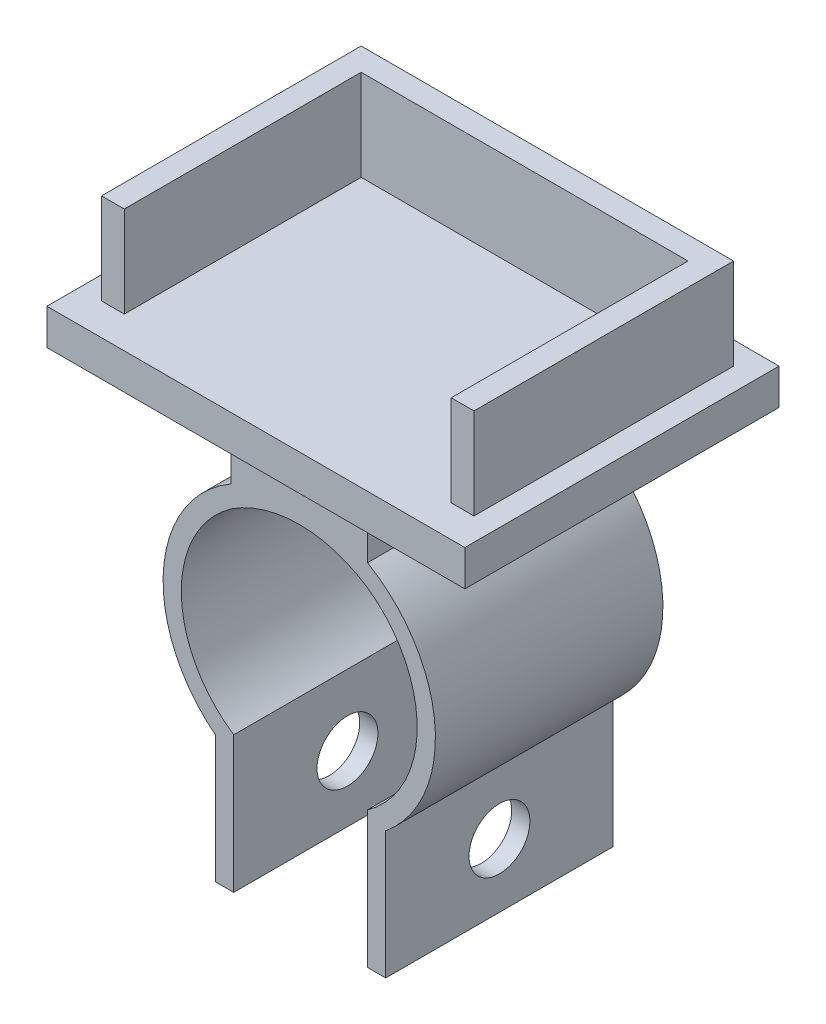
ISO-10303-21;
HEADER;
FILE_DESCRIPTION(('STEP AP214'),'2;1');
FILE_NAME('part.step','',(''),(''),'','','');
FILE_SCHEMA(('AUTOMOTIVE_DESIGN { 1 0 10303 214 1 1 1 1 }'));
ENDSEC;
DATA;
#1=APPLICATION_CONTEXT('core data for automotive mechanical design processes');
#2=APPLICATION_PROTOCOL_DEFINITION('international standard','automotive_design',2000,#1);
#3=PRODUCT_CONTEXT('',#1,'mechanical');
#4=PRODUCT('Part','Part','',(#3));
#5=PRODUCT_RELATED_PRODUCT_CATEGORY('part','',(#4));
#6=PRODUCT_DEFINITION_FORMATION('','',#4);
#7=PRODUCT_DEFINITION_CONTEXT('part definition',#1,'design');
#8=PRODUCT_DEFINITION('design','',#6,#7);
#9=PRODUCT_DEFINITION_SHAPE('','',#8);
#10=(LENGTH_UNIT() NAMED_UNIT(*) SI_UNIT(.MILLI.,.METRE.));
#11=(NAMED_UNIT(*) PLANE_ANGLE_UNIT() SI_UNIT($,.RADIAN.));
#12=(NAMED_UNIT(*) SI_UNIT($,.STERADIAN.) SOLID_ANGLE_UNIT());
#13=UNCERTAINTY_MEASURE_WITH_UNIT(LENGTH_MEASURE(1.E-05),#10,'distance_accuracy_value','');
#14=(GEOMETRIC_REPRESENTATION_CONTEXT(3) GLOBAL_UNCERTAINTY_ASSIGNED_CONTEXT((#13)) GLOBAL_UNIT_ASSIGNED_CONTEXT((#10,
#11,#12)) REPRESENTATION_CONTEXT('',''));
#15=CARTESIAN_POINT('',(0.,0.,0.));
#16=DIRECTION('',(0.,0.,1.));
#17=DIRECTION('',(1.,0.,0.));
#18=AXIS2_PLACEMENT_3D('',#15,#16,#17);
#19=CARTESIAN_POINT('',(0.,0.,0.));
#20=DIRECTION('',(0.,1.,0.));
#21=DIRECTION('',(0.,0.,1.));
#22=AXIS2_PLACEMENT_3D('',#19,#20,#21);
#23=PLANE('',#22);
#24=DIRECTION('',(1.,0.,0.));
#25=VECTOR('',#24,1.);
#26=CARTESIAN_POINT('',(0.,0.,0.));
#27=LINE('',#26,#25);
#28=CARTESIAN_POINT('',(0.,0.,0.));
#29=VERTEX_POINT('',#28);
#30=CARTESIAN_POINT('',(23.330000076,0.,0.));
#31=VERTEX_POINT('',#30);
#32=EDGE_CURVE('E305',#29,#31,#27,.T.);
#33=ORIENTED_EDGE('',*,*,#32,.F.);
#34=DIRECTION('',(0.,0.,-1.));
#35=VECTOR('',#34,1.);
#36=CARTESIAN_POINT('',(0.,0.,0.));
#37=LINE('',#36,#35);
#38=CARTESIAN_POINT('',(0.,0.,-17.539999972));
#39=VERTEX_POINT('',#38);
#40=EDGE_CURVE('E310',#29,#39,#37,.T.);
#41=ORIENTED_EDGE('',*,*,#40,.T.);
#42=DIRECTION('',(1.,0.,0.));
#43=VECTOR('',#42,1.);
#44=CARTESIAN_POINT('',(0.,0.,-17.539999972));
#45=LINE('',#44,#43);
#46=CARTESIAN_POINT('',(23.330000076,0.,-17.539999972));
#47=VERTEX_POINT('',#46);
#48=EDGE_CURVE('E324',#39,#47,#45,.T.);
#49=ORIENTED_EDGE('',*,*,#48,.T.);
#50=DIRECTION('',(0.,0.,-1.));
#51=VECTOR('',#50,1.);
#52=CARTESIAN_POINT('',(23.330000076,0.,0.));
#53=LINE('',#52,#51);
#54=EDGE_CURVE('E321',#31,#47,#53,.T.);
#55=ORIENTED_EDGE('',*,*,#54,.F.);
#56=EDGE_LOOP('',(#33,#41,#49,#55));
#57=FACE_BOUND('',#56,.T.);
#58=DIRECTION('',(0.,0.,-1.));
#59=VECTOR('',#58,1.);
#60=CARTESIAN_POINT('',(7.855000038,0.,-2.41999998599999));
#61=LINE('',#60,#59);
#62=CARTESIAN_POINT('',(7.855000038,0.,-2.41999998599999));
#63=VERTEX_POINT('',#62);
#64=CARTESIAN_POINT('',(7.85500003800001,0.,-15.119999986));
#65=VERTEX_POINT('',#64);
#66=EDGE_CURVE('E242',#63,#65,#61,.T.);
#67=ORIENTED_EDGE('',*,*,#66,.F.);
#68=DIRECTION('',(-1.,0.,0.));
#69=VECTOR('',#68,1.);
#70=CARTESIAN_POINT('',(7.855000038,0.,-2.41999998599999));
#71=LINE('',#70,#69);
#72=CARTESIAN_POINT('',(15.475000038,0.,-2.41999998599999));
#73=VERTEX_POINT('',#72);
#74=EDGE_CURVE('E727',#73,#63,#71,.T.);
#75=ORIENTED_EDGE('',*,*,#74,.F.);
#76=DIRECTION('',(0.,0.,1.));
#77=VECTOR('',#76,1.);
#78=CARTESIAN_POINT('',(15.475000038,0.,-2.41999998599999));
#79=LINE('',#78,#77);
#80=CARTESIAN_POINT('',(15.475000038,0.,-15.119999986));
#81=VERTEX_POINT('',#80);
#82=EDGE_CURVE('E733',#81,#73,#79,.T.);
#83=ORIENTED_EDGE('',*,*,#82,.F.);
#84=DIRECTION('',(1.,0.,0.));
#85=VECTOR('',#84,1.);
#86=CARTESIAN_POINT('',(7.85500003800001,0.,-15.119999986));
#87=LINE('',#86,#85);
#88=EDGE_CURVE('E731',#65,#81,#87,.T.);
#89=ORIENTED_EDGE('',*,*,#88,.F.);
#90=EDGE_LOOP('',(#67,#75,#83,#89));
#91=FACE_BOUND('',#90,.T.);
#92=ADVANCED_FACE('F43',(#57,#91),#23,.F.);
#93=CARTESIAN_POINT('',(0.,2.,0.));
#94=DIRECTION('',(0.,1.,0.));
#95=DIRECTION('',(0.,0.,1.));
#96=AXIS2_PLACEMENT_3D('',#93,#94,#95);
#97=PLANE('',#96);
#98=DIRECTION('',(1.,0.,0.));
#99=VECTOR('',#98,1.);
#100=CARTESIAN_POINT('',(0.,2.,0.));
#101=LINE('',#100,#99);
#102=CARTESIAN_POINT('',(0.,2.,0.));
#103=VERTEX_POINT('',#102);
#104=CARTESIAN_POINT('',(23.330000076,2.,0.));
#105=VERTEX_POINT('',#104);
#106=EDGE_CURVE('E306',#103,#105,#101,.T.);
#107=ORIENTED_EDGE('',*,*,#106,.T.);
#108=DIRECTION('',(0.,0.,-1.));
#109=VECTOR('',#108,1.);
#110=CARTESIAN_POINT('',(23.330000076,2.,0.));
#111=LINE('',#110,#109);
#112=CARTESIAN_POINT('',(23.330000076,2.,-17.539999972));
#113=VERTEX_POINT('',#112);
#114=EDGE_CURVE('E309',#105,#113,#111,.T.);
#115=ORIENTED_EDGE('',*,*,#114,.T.);
#116=DIRECTION('',(1.,0.,0.));
#117=VECTOR('',#116,1.);
#118=CARTESIAN_POINT('',(0.,2.,-17.539999972));
#119=LINE('',#118,#117);
#120=CARTESIAN_POINT('',(0.,2.,-17.539999972));
#121=VERTEX_POINT('',#120);
#122=EDGE_CURVE('E312',#121,#113,#119,.T.);
#123=ORIENTED_EDGE('',*,*,#122,.F.);
#124=DIRECTION('',(0.,0.,-1.));
#125=VECTOR('',#124,1.);
#126=CARTESIAN_POINT('',(0.,2.,0.));
#127=LINE('',#126,#125);
#128=EDGE_CURVE('E315',#103,#121,#127,.T.);
#129=ORIENTED_EDGE('',*,*,#128,.F.);
#130=EDGE_LOOP('',(#107,#115,#123,#129));
#131=FACE_BOUND('',#130,.T.);
#132=DIRECTION('',(0.,0.,1.));
#133=VECTOR('',#132,1.);
#134=CARTESIAN_POINT('',(1.27,2.,-1.778));
#135=LINE('',#134,#133);
#136=CARTESIAN_POINT('',(1.27,2.,-16.269999972));
#137=VERTEX_POINT('',#136);
#138=CARTESIAN_POINT('',(1.27,2.,-1.778));
#139=VERTEX_POINT('',#138);
#140=EDGE_CURVE('E247',#137,#139,#135,.T.);
#141=ORIENTED_EDGE('',*,*,#140,.F.);
#142=DIRECTION('',(-1.,0.,0.));
#143=VECTOR('',#142,1.);
#144=CARTESIAN_POINT('',(22.060000076,2.,-16.269999972));
#145=LINE('',#144,#143);
#146=CARTESIAN_POINT('',(22.060000076,2.,-16.269999972));
#147=VERTEX_POINT('',#146);
#148=EDGE_CURVE('E243',#147,#137,#145,.T.);
#149=ORIENTED_EDGE('',*,*,#148,.F.);
#150=DIRECTION('',(0.,0.,-1.));
#151=VECTOR('',#150,1.);
#152=CARTESIAN_POINT('',(22.060000076,2.,-16.269999972));
#153=LINE('',#152,#151);
#154=CARTESIAN_POINT('',(22.060000076,2.,-1.778));
#155=VERTEX_POINT('',#154);
#156=EDGE_CURVE('E256',#155,#147,#153,.T.);
#157=ORIENTED_EDGE('',*,*,#156,.F.);
#158=DIRECTION('',(1.,0.,0.));
#159=VECTOR('',#158,1.);
#160=CARTESIAN_POINT('',(20.790000076,2.,-1.778));
#161=LINE('',#160,#159);
#162=CARTESIAN_POINT('',(20.790000076,2.,-1.778));
#163=VERTEX_POINT('',#162);
#164=EDGE_CURVE('E280',#163,#155,#161,.T.);
#165=ORIENTED_EDGE('',*,*,#164,.F.);
#166=DIRECTION('',(0.,0.,1.));
#167=VECTOR('',#166,1.);
#168=CARTESIAN_POINT('',(20.790000076,2.,-14.999999972));
#169=LINE('',#168,#167);
#170=CARTESIAN_POINT('',(20.790000076,2.,-14.999999972));
#171=VERTEX_POINT('',#170);
#172=EDGE_CURVE('E278',#171,#163,#169,.T.);
#173=ORIENTED_EDGE('',*,*,#172,.F.);
#174=DIRECTION('',(1.,0.,0.));
#175=VECTOR('',#174,1.);
#176=CARTESIAN_POINT('',(20.790000076,2.,-14.999999972));
#177=LINE('',#176,#175);
#178=CARTESIAN_POINT('',(2.54,2.,-14.999999972));
#179=VERTEX_POINT('',#178);
#180=EDGE_CURVE('E276',#179,#171,#177,.T.);
#181=ORIENTED_EDGE('',*,*,#180,.F.);
#182=DIRECTION('',(0.,0.,-1.));
#183=VECTOR('',#182,1.);
#184=CARTESIAN_POINT('',(2.54,2.,-1.778));
#185=LINE('',#184,#183);
#186=CARTESIAN_POINT('',(2.54,2.,-1.778));
#187=VERTEX_POINT('',#186);
#188=EDGE_CURVE('E274',#187,#179,#185,.T.);
#189=ORIENTED_EDGE('',*,*,#188,.F.);
#190=DIRECTION('',(1.,0.,0.));
#191=VECTOR('',#190,1.);
#192=CARTESIAN_POINT('',(1.27,2.,-1.778));
#193=LINE('',#192,#191);
#194=EDGE_CURVE('E272',#139,#187,#193,.T.);
#195=ORIENTED_EDGE('',*,*,#194,.F.);
#196=EDGE_LOOP('',(#141,#149,#157,#165,#173,#181,#189,#195));
#197=FACE_BOUND('',#196,.T.);
#198=ADVANCED_FACE('F349',(#131,#197),#97,.T.);
#199=CARTESIAN_POINT('',(0.,2.,0.));
#200=DIRECTION('',(0.,0.,-1.));
#201=DIRECTION('',(-1.,0.,0.));
#202=AXIS2_PLACEMENT_3D('',#199,#200,#201);
#203=PLANE('',#202);
#204=ORIENTED_EDGE('',*,*,#32,.T.);
#205=DIRECTION('',(0.,-1.,0.));
#206=VECTOR('',#205,1.);
#207=CARTESIAN_POINT('',(23.330000076,2.,0.));
#208=LINE('',#207,#206);
#209=EDGE_CURVE('E11',#105,#31,#208,.T.);
#210=ORIENTED_EDGE('',*,*,#209,.F.);
#211=ORIENTED_EDGE('',*,*,#106,.F.);
#212=DIRECTION('',(0.,-1.,0.));
#213=VECTOR('',#212,1.);
#214=CARTESIAN_POINT('',(0.,2.,0.));
#215=LINE('',#214,#213);
#216=EDGE_CURVE('E318',#103,#29,#215,.T.);
#217=ORIENTED_EDGE('',*,*,#216,.T.);
#218=EDGE_LOOP('',(#204,#210,#211,#217));
#219=FACE_BOUND('',#218,.T.);
#220=ADVANCED_FACE('F45',(#219),#203,.F.);
#221=CARTESIAN_POINT('',(23.330000076,2.,0.));
#222=DIRECTION('',(-1.,0.,0.));
#223=DIRECTION('',(0.,0.,1.));
#224=AXIS2_PLACEMENT_3D('',#221,#222,#223);
#225=PLANE('',#224);
#226=ORIENTED_EDGE('',*,*,#54,.T.);
#227=DIRECTION('',(0.,-1.,0.));
#228=VECTOR('',#227,1.);
#229=CARTESIAN_POINT('',(23.330000076,2.,-17.539999972));
#230=LINE('',#229,#228);
#231=EDGE_CURVE('E52',#113,#47,#230,.T.);
#232=ORIENTED_EDGE('',*,*,#231,.F.);
#233=ORIENTED_EDGE('',*,*,#114,.F.);
#234=ORIENTED_EDGE('',*,*,#209,.T.);
#235=EDGE_LOOP('',(#226,#232,#233,#234));
#236=FACE_BOUND('',#235,.T.);
#237=ADVANCED_FACE('F338',(#236),#225,.F.);
#238=CARTESIAN_POINT('',(0.,2.,-17.539999972));
#239=DIRECTION('',(0.,0.,-1.));
#240=DIRECTION('',(-1.,0.,0.));
#241=AXIS2_PLACEMENT_3D('',#238,#239,#240);
#242=PLANE('',#241);
#243=ORIENTED_EDGE('',*,*,#48,.F.);
#244=DIRECTION('',(0.,-1.,0.));
#245=VECTOR('',#244,1.);
#246=CARTESIAN_POINT('',(0.,2.,-17.539999972));
#247=LINE('',#246,#245);
#248=EDGE_CURVE('E330',#121,#39,#247,.T.);
#249=ORIENTED_EDGE('',*,*,#248,.F.);
#250=ORIENTED_EDGE('',*,*,#122,.T.);
#251=ORIENTED_EDGE('',*,*,#231,.T.);
#252=EDGE_LOOP('',(#243,#249,#250,#251));
#253=FACE_BOUND('',#252,.T.);
#254=ADVANCED_FACE('F335',(#253),#242,.T.);
#255=CARTESIAN_POINT('',(0.,2.,0.));
#256=DIRECTION('',(-1.,0.,0.));
#257=DIRECTION('',(0.,0.,1.));
#258=AXIS2_PLACEMENT_3D('',#255,#256,#257);
#259=PLANE('',#258);
#260=ORIENTED_EDGE('',*,*,#40,.F.);
#261=ORIENTED_EDGE('',*,*,#216,.F.);
#262=ORIENTED_EDGE('',*,*,#128,.T.);
#263=ORIENTED_EDGE('',*,*,#248,.T.);
#264=EDGE_LOOP('',(#260,#261,#262,#263));
#265=FACE_BOUND('',#264,.T.);
#266=ADVANCED_FACE('F345',(#265),#259,.T.);
#267=CARTESIAN_POINT('',(22.060000076,7.08,-16.269999972));
#268=DIRECTION('',(0.,0.,1.));
#269=DIRECTION('',(1.,0.,0.));
#270=AXIS2_PLACEMENT_3D('',#267,#268,#269);
#271=PLANE('',#270);
#272=ORIENTED_EDGE('',*,*,#148,.T.);
#273=DIRECTION('',(0.,-1.,0.));
#274=VECTOR('',#273,1.);
#275=CARTESIAN_POINT('',(1.27,7.08,-16.269999972));
#276=LINE('',#275,#274);
#277=CARTESIAN_POINT('',(1.27,7.08,-16.269999972));
#278=VERTEX_POINT('',#277);
#279=EDGE_CURVE('E303',#278,#137,#276,.T.);
#280=ORIENTED_EDGE('',*,*,#279,.F.);
#281=DIRECTION('',(-1.,0.,0.));
#282=VECTOR('',#281,1.);
#283=CARTESIAN_POINT('',(22.060000076,7.08,-16.269999972));
#284=LINE('',#283,#282);
#285=CARTESIAN_POINT('',(22.060000076,7.08,-16.269999972));
#286=VERTEX_POINT('',#285);
#287=EDGE_CURVE('E252',#286,#278,#284,.T.);
#288=ORIENTED_EDGE('',*,*,#287,.F.);
#289=DIRECTION('',(0.,-1.,0.));
#290=VECTOR('',#289,1.);
#291=CARTESIAN_POINT('',(22.060000076,7.08,-16.269999972));
#292=LINE('',#291,#290);
#293=EDGE_CURVE('E269',#286,#147,#292,.T.);
#294=ORIENTED_EDGE('',*,*,#293,.T.);
#295=EDGE_LOOP('',(#272,#280,#288,#294));
#296=FACE_BOUND('',#295,.T.);
#297=ADVANCED_FACE('F368',(#296),#271,.F.);
#298=CARTESIAN_POINT('',(1.27,7.08,-1.778));
#299=DIRECTION('',(1.,0.,0.));
#300=DIRECTION('',(0.,0.,-1.));
#301=AXIS2_PLACEMENT_3D('',#298,#299,#300);
#302=PLANE('',#301);
#303=ORIENTED_EDGE('',*,*,#140,.T.);
#304=DIRECTION('',(0.,-1.,0.));
#305=VECTOR('',#304,1.);
#306=CARTESIAN_POINT('',(1.27,7.08,-1.778));
#307=LINE('',#306,#305);
#308=CARTESIAN_POINT('',(1.27,7.08,-1.778));
#309=VERTEX_POINT('',#308);
#310=EDGE_CURVE('E300',#309,#139,#307,.T.);
#311=ORIENTED_EDGE('',*,*,#310,.F.);
#312=DIRECTION('',(0.,0.,1.));
#313=VECTOR('',#312,1.);
#314=CARTESIAN_POINT('',(1.27,7.08,-1.778));
#315=LINE('',#314,#313);
#316=EDGE_CURVE('E255',#278,#309,#315,.T.);
#317=ORIENTED_EDGE('',*,*,#316,.F.);
#318=ORIENTED_EDGE('',*,*,#279,.T.);
#319=EDGE_LOOP('',(#303,#311,#317,#318));
#320=FACE_BOUND('',#319,.T.);
#321=ADVANCED_FACE('F391',(#320),#302,.F.);
#322=CARTESIAN_POINT('',(1.27,7.08,-1.778));
#323=DIRECTION('',(0.,0.,-1.));
#324=DIRECTION('',(-1.,0.,0.));
#325=AXIS2_PLACEMENT_3D('',#322,#323,#324);
#326=PLANE('',#325);
#327=ORIENTED_EDGE('',*,*,#194,.T.);
#328=DIRECTION('',(0.,-1.,0.));
#329=VECTOR('',#328,1.);
#330=CARTESIAN_POINT('',(2.54,7.08,-1.778));
#331=LINE('',#330,#329);
#332=CARTESIAN_POINT('',(2.54,7.08,-1.778));
#333=VERTEX_POINT('',#332);
#334=EDGE_CURVE('E297',#333,#187,#331,.T.);
#335=ORIENTED_EDGE('',*,*,#334,.F.);
#336=DIRECTION('',(1.,0.,0.));
#337=VECTOR('',#336,1.);
#338=CARTESIAN_POINT('',(1.27,7.08,-1.778));
#339=LINE('',#338,#337);
#340=EDGE_CURVE('E258',#309,#333,#339,.T.);
#341=ORIENTED_EDGE('',*,*,#340,.F.);
#342=ORIENTED_EDGE('',*,*,#310,.T.);
#343=EDGE_LOOP('',(#327,#335,#341,#342));
#344=FACE_BOUND('',#343,.T.);
#345=ADVANCED_FACE('F398',(#344),#326,.F.);
#346=CARTESIAN_POINT('',(2.54,7.08,-1.778));
#347=DIRECTION('',(-1.,0.,0.));
#348=DIRECTION('',(0.,0.,1.));
#349=AXIS2_PLACEMENT_3D('',#346,#347,#348);
#350=PLANE('',#349);
#351=ORIENTED_EDGE('',*,*,#188,.T.);
#352=DIRECTION('',(0.,-1.,0.));
#353=VECTOR('',#352,1.);
#354=CARTESIAN_POINT('',(2.54,7.08,-14.999999972));
#355=LINE('',#354,#353);
#356=CARTESIAN_POINT('',(2.54,7.08,-14.999999972));
#357=VERTEX_POINT('',#356);
#358=EDGE_CURVE('E294',#357,#179,#355,.T.);
#359=ORIENTED_EDGE('',*,*,#358,.F.);
#360=DIRECTION('',(0.,0.,-1.));
#361=VECTOR('',#360,1.);
#362=CARTESIAN_POINT('',(2.54,7.08,-1.778));
#363=LINE('',#362,#361);
#364=EDGE_CURVE('E260',#333,#357,#363,.T.);
#365=ORIENTED_EDGE('',*,*,#364,.F.);
#366=ORIENTED_EDGE('',*,*,#334,.T.);
#367=EDGE_LOOP('',(#351,#359,#365,#366));
#368=FACE_BOUND('',#367,.T.);
#369=ADVANCED_FACE('F407',(#368),#350,.F.);
#370=CARTESIAN_POINT('',(20.790000076,7.08,-14.999999972));
#371=DIRECTION('',(0.,0.,-1.));
#372=DIRECTION('',(-1.,0.,0.));
#373=AXIS2_PLACEMENT_3D('',#370,#371,#372);
#374=PLANE('',#373);
#375=ORIENTED_EDGE('',*,*,#180,.T.);
#376=DIRECTION('',(0.,-1.,0.));
#377=VECTOR('',#376,1.);
#378=CARTESIAN_POINT('',(20.790000076,7.08,-14.999999972));
#379=LINE('',#378,#377);
#380=CARTESIAN_POINT('',(20.790000076,7.08,-14.999999972));
#381=VERTEX_POINT('',#380);
#382=EDGE_CURVE('E291',#381,#171,#379,.T.);
#383=ORIENTED_EDGE('',*,*,#382,.F.);
#384=DIRECTION('',(1.,0.,0.));
#385=VECTOR('',#384,1.);
#386=CARTESIAN_POINT('',(20.790000076,7.08,-14.999999972));
#387=LINE('',#386,#385);
#388=EDGE_CURVE('E262',#357,#381,#387,.T.);
#389=ORIENTED_EDGE('',*,*,#388,.F.);
#390=ORIENTED_EDGE('',*,*,#358,.T.);
#391=EDGE_LOOP('',(#375,#383,#389,#390));
#392=FACE_BOUND('',#391,.T.);
#393=ADVANCED_FACE('F416',(#392),#374,.F.);
#394=CARTESIAN_POINT('',(20.790000076,7.08,-14.999999972));
#395=DIRECTION('',(1.,0.,0.));
#396=DIRECTION('',(0.,0.,-1.));
#397=AXIS2_PLACEMENT_3D('',#394,#395,#396);
#398=PLANE('',#397);
#399=ORIENTED_EDGE('',*,*,#172,.T.);
#400=DIRECTION('',(0.,-1.,0.));
#401=VECTOR('',#400,1.);
#402=CARTESIAN_POINT('',(20.790000076,7.08,-1.778));
#403=LINE('',#402,#401);
#404=CARTESIAN_POINT('',(20.790000076,7.08,-1.778));
#405=VERTEX_POINT('',#404);
#406=EDGE_CURVE('E288',#405,#163,#403,.T.);
#407=ORIENTED_EDGE('',*,*,#406,.F.);
#408=DIRECTION('',(0.,0.,1.));
#409=VECTOR('',#408,1.);
#410=CARTESIAN_POINT('',(20.790000076,7.08,-14.999999972));
#411=LINE('',#410,#409);
#412=EDGE_CURVE('E264',#381,#405,#411,.T.);
#413=ORIENTED_EDGE('',*,*,#412,.F.);
#414=ORIENTED_EDGE('',*,*,#382,.T.);
#415=EDGE_LOOP('',(#399,#407,#413,#414));
#416=FACE_BOUND('',#415,.T.);
#417=ADVANCED_FACE('F425',(#416),#398,.F.);
#418=CARTESIAN_POINT('',(20.790000076,7.08,-1.778));
#419=DIRECTION('',(0.,0.,-1.));
#420=DIRECTION('',(-1.,0.,0.));
#421=AXIS2_PLACEMENT_3D('',#418,#419,#420);
#422=PLANE('',#421);
#423=ORIENTED_EDGE('',*,*,#164,.T.);
#424=DIRECTION('',(0.,-1.,0.));
#425=VECTOR('',#424,1.);
#426=CARTESIAN_POINT('',(22.060000076,7.08,-1.778));
#427=LINE('',#426,#425);
#428=CARTESIAN_POINT('',(22.060000076,7.08,-1.778));
#429=VERTEX_POINT('',#428);
#430=EDGE_CURVE('E286',#429,#155,#427,.T.);
#431=ORIENTED_EDGE('',*,*,#430,.F.);
#432=DIRECTION('',(1.,0.,0.));
#433=VECTOR('',#432,1.);
#434=CARTESIAN_POINT('',(20.790000076,7.08,-1.778));
#435=LINE('',#434,#433);
#436=EDGE_CURVE('E266',#405,#429,#435,.T.);
#437=ORIENTED_EDGE('',*,*,#436,.F.);
#438=ORIENTED_EDGE('',*,*,#406,.T.);
#439=EDGE_LOOP('',(#423,#431,#437,#438));
#440=FACE_BOUND('',#439,.T.);
#441=ADVANCED_FACE('F434',(#440),#422,.F.);
#442=CARTESIAN_POINT('',(22.060000076,7.08,-16.269999972));
#443=DIRECTION('',(-1.,0.,0.));
#444=DIRECTION('',(0.,0.,1.));
#445=AXIS2_PLACEMENT_3D('',#442,#443,#444);
#446=PLANE('',#445);
#447=ORIENTED_EDGE('',*,*,#156,.T.);
#448=ORIENTED_EDGE('',*,*,#293,.F.);
#449=DIRECTION('',(0.,0.,-1.));
#450=VECTOR('',#449,1.);
#451=CARTESIAN_POINT('',(22.060000076,7.08,-16.269999972));
#452=LINE('',#451,#450);
#453=EDGE_CURVE('E268',#429,#286,#452,.T.);
#454=ORIENTED_EDGE('',*,*,#453,.F.);
#455=ORIENTED_EDGE('',*,*,#430,.T.);
#456=EDGE_LOOP('',(#447,#448,#454,#455));
#457=FACE_BOUND('',#456,.T.);
#458=ADVANCED_FACE('F443',(#457),#446,.F.);
#459=CARTESIAN_POINT('',(0.,7.08,0.));
#460=DIRECTION('',(0.,-1.,0.));
#461=DIRECTION('',(0.,0.,-1.));
#462=AXIS2_PLACEMENT_3D('',#459,#460,#461);
#463=PLANE('',#462);
#464=ORIENTED_EDGE('',*,*,#287,.T.);
#465=ORIENTED_EDGE('',*,*,#316,.T.);
#466=ORIENTED_EDGE('',*,*,#340,.T.);
#467=ORIENTED_EDGE('',*,*,#364,.T.);
#468=ORIENTED_EDGE('',*,*,#388,.T.);
#469=ORIENTED_EDGE('',*,*,#412,.T.);
#470=ORIENTED_EDGE('',*,*,#436,.T.);
#471=ORIENTED_EDGE('',*,*,#453,.T.);
#472=EDGE_LOOP('',(#464,#465,#466,#467,#468,#469,#470,#471));
#473=FACE_BOUND('',#472,.T.);
#474=ADVANCED_FACE('F451',(#473),#463,.F.);
#475=CARTESIAN_POINT('',(7.855000038,-5.08,-2.41999998599999));
#476=DIRECTION('',(1.,0.,0.));
#477=DIRECTION('',(0.,0.,-1.));
#478=AXIS2_PLACEMENT_3D('',#475,#476,#477);
#479=PLANE('',#478);
#480=DIRECTION('',(0.,1.,0.));
#481=VECTOR('',#480,1.);
#482=CARTESIAN_POINT('',(7.85500003800001,-5.08,-15.119999986));
#483=LINE('',#482,#481);
#484=CARTESIAN_POINT('',(7.855000038,-3.87366089311895,-15.119999986));
#485=VERTEX_POINT('',#484);
#486=EDGE_CURVE('E235',#485,#65,#483,.T.);
#487=ORIENTED_EDGE('',*,*,#486,.F.);
#488=DIRECTION('',(0.,0.,1.));
#489=VECTOR('',#488,1.);
#490=CARTESIAN_POINT('',(7.855000038,-3.87366089311895,-15.119999986));
#491=LINE('',#490,#489);
#492=CARTESIAN_POINT('',(7.855000038,-3.87366089311895,-2.41999998599999));
#493=VERTEX_POINT('',#492);
#494=EDGE_CURVE('E220',#485,#493,#491,.T.);
#495=ORIENTED_EDGE('',*,*,#494,.T.);
#496=DIRECTION('',(0.,1.,0.));
#497=VECTOR('',#496,1.);
#498=CARTESIAN_POINT('',(7.855000038,-5.08,-2.41999998599999));
#499=LINE('',#498,#497);
#500=EDGE_CURVE('E59',#493,#63,#499,.T.);
#501=ORIENTED_EDGE('',*,*,#500,.T.);
#502=ORIENTED_EDGE('',*,*,#66,.T.);
#503=EDGE_LOOP('',(#487,#495,#501,#502));
#504=FACE_BOUND('',#503,.T.);
#505=ADVANCED_FACE('F241',(#504),#479,.F.);
#506=CARTESIAN_POINT('',(7.85500003800001,-5.08,-15.119999986));
#507=DIRECTION('',(0.,0.,1.));
#508=DIRECTION('',(1.,0.,0.));
#509=AXIS2_PLACEMENT_3D('',#506,#507,#508);
#510=PLANE('',#509);
#511=DIRECTION('',(0.,1.,0.));
#512=VECTOR('',#511,1.);
#513=CARTESIAN_POINT('',(15.475000038,-5.08,-15.119999986));
#514=LINE('',#513,#512);
#515=CARTESIAN_POINT('',(15.475000038,-3.87366089311895,-15.119999986));
#516=VERTEX_POINT('',#515);
#517=EDGE_CURVE('E244',#516,#81,#514,.T.);
#518=ORIENTED_EDGE('',*,*,#517,.F.);
#519=CARTESIAN_POINT('',(11.665000038,-10.4502866645958,-15.119999986));
#520=DIRECTION('',(0.,0.,1.));
#521=DIRECTION('',(1.,0.,0.));
#522=AXIS2_PLACEMENT_3D('',#519,#520,#521);
#523=CIRCLE('',#522,7.60053330616041);
#524=CARTESIAN_POINT('',(16.491000038,-16.3220692336334,-15.119999986));
#525=VERTEX_POINT('',#524);
#526=EDGE_CURVE('E685',#525,#516,#523,.T.);
#527=ORIENTED_EDGE('',*,*,#526,.F.);
#528=DIRECTION('',(0.,-1.,0.));
#529=VECTOR('',#528,1.);
#530=CARTESIAN_POINT('',(16.491000038,0.,-15.119999986));
#531=LINE('',#530,#529);
#532=CARTESIAN_POINT('',(16.491000038,-23.4405733291917,-15.119999986));
#533=VERTEX_POINT('',#532);
#534=EDGE_CURVE('E683',#525,#533,#531,.T.);
#535=ORIENTED_EDGE('',*,*,#534,.T.);
#536=DIRECTION('',(1.,0.,0.));
#537=VECTOR('',#536,1.);
#538=CARTESIAN_POINT('',(0.,-23.4405733291917,-15.119999986));
#539=LINE('',#538,#537);
#540=CARTESIAN_POINT('',(15.475000038,-23.4405733291917,-15.119999986));
#541=VERTEX_POINT('',#540);
#542=EDGE_CURVE('E693',#541,#533,#539,.T.);
#543=ORIENTED_EDGE('',*,*,#542,.F.);
#544=DIRECTION('',(0.,-1.,0.));
#545=VECTOR('',#544,1.);
#546=CARTESIAN_POINT('',(15.475000038,0.,-15.119999986));
#547=LINE('',#546,#545);
#548=CARTESIAN_POINT('',(15.475000038,-15.8205733291917,-15.119999986));
#549=VERTEX_POINT('',#548);
#550=EDGE_CURVE('E690',#549,#541,#547,.T.);
#551=ORIENTED_EDGE('',*,*,#550,.F.);
#552=CARTESIAN_POINT('',(11.665000038,-10.4502866645958,-15.119999986));
#553=DIRECTION('',(0.,0.,1.));
#554=DIRECTION('',(1.,0.,0.));
#555=AXIS2_PLACEMENT_3D('',#552,#553,#554);
#556=CIRCLE('',#555,6.58453330616041);
#557=CARTESIAN_POINT('',(15.475000038,-5.08,-15.119999986));
#558=VERTEX_POINT('',#557);
#559=EDGE_CURVE('E688',#549,#558,#556,.T.);
#560=ORIENTED_EDGE('',*,*,#559,.T.);
#561=CARTESIAN_POINT('',(11.665000038,-10.7822858574435,-15.119999986));
#562=DIRECTION('',(0.,0.,1.));
#563=DIRECTION('',(1.,0.,0.));
#564=AXIS2_PLACEMENT_3D('',#561,#562,#563);
#565=CIRCLE('',#564,6.858);
#566=CARTESIAN_POINT('',(7.855000038,-5.08,-15.119999986));
#567=VERTEX_POINT('',#566);
#568=EDGE_CURVE('E720',#558,#567,#565,.T.);
#569=ORIENTED_EDGE('',*,*,#568,.T.);
#570=CARTESIAN_POINT('',(11.665000038,-10.4502866645958,-15.119999986));
#571=DIRECTION('',(0.,0.,1.));
#572=DIRECTION('',(1.,0.,0.));
#573=AXIS2_PLACEMENT_3D('',#570,#571,#572);
#574=CIRCLE('',#573,6.58453330616041);
#575=CARTESIAN_POINT('',(8.006925979022,-15.9251905942523,-15.119999986));
#576=VERTEX_POINT('',#575);
#577=EDGE_CURVE('E228',#567,#576,#574,.T.);
#578=ORIENTED_EDGE('',*,*,#577,.T.);
#579=DIRECTION('',(0.,-1.,0.));
#580=VECTOR('',#579,1.);
#581=CARTESIAN_POINT('',(8.006925979022,0.,-15.119999986));
#582=LINE('',#581,#580);
#583=CARTESIAN_POINT('',(8.006925979022,-23.5451905942523,-15.119999986));
#584=VERTEX_POINT('',#583);
#585=EDGE_CURVE('E660',#576,#584,#582,.T.);
#586=ORIENTED_EDGE('',*,*,#585,.T.);
#587=DIRECTION('',(-1.,0.,0.));
#588=VECTOR('',#587,1.);
#589=CARTESIAN_POINT('',(0.,-23.5451905942523,-15.119999986));
#590=LINE('',#589,#588);
#591=CARTESIAN_POINT('',(6.990925979022,-23.5451905942523,-15.119999986));
#592=VERTEX_POINT('',#591);
#593=EDGE_CURVE('E658',#584,#592,#590,.T.);
#594=ORIENTED_EDGE('',*,*,#593,.T.);
#595=DIRECTION('',(0.,-1.,0.));
#596=VECTOR('',#595,1.);
#597=CARTESIAN_POINT('',(6.99092597902199,0.,-15.119999986));
#598=LINE('',#597,#596);
#599=CARTESIAN_POINT('',(6.990925979022,-16.4437112473567,-15.119999986));
#600=VERTEX_POINT('',#599);
#601=EDGE_CURVE('E238',#600,#592,#598,.T.);
#602=ORIENTED_EDGE('',*,*,#601,.F.);
#603=CARTESIAN_POINT('',(11.665000038,-10.4502866645958,-15.119999986));
#604=DIRECTION('',(0.,0.,1.));
#605=DIRECTION('',(1.,0.,0.));
#606=AXIS2_PLACEMENT_3D('',#603,#604,#605);
#607=CIRCLE('',#606,7.60053330616041);
#608=EDGE_CURVE('E223',#485,#600,#607,.T.);
#609=ORIENTED_EDGE('',*,*,#608,.F.);
#610=ORIENTED_EDGE('',*,*,#486,.T.);
#611=ORIENTED_EDGE('',*,*,#88,.T.);
#612=EDGE_LOOP('',(#518,#527,#535,#543,#551,#560,#569,#578,#586,#594,#602,#609,#610,#611));
#613=FACE_BOUND('',#612,.T.);
#614=ADVANCED_FACE('F233',(#613),#510,.F.);
#615=CARTESIAN_POINT('',(15.475000038,-5.08,-2.41999998599999));
#616=DIRECTION('',(-1.,0.,0.));
#617=DIRECTION('',(0.,0.,1.));
#618=AXIS2_PLACEMENT_3D('',#615,#616,#617);
#619=PLANE('',#618);
#620=DIRECTION('',(0.,1.,0.));
#621=VECTOR('',#620,1.);
#622=CARTESIAN_POINT('',(15.475000038,-5.08,-2.41999998599999));
#623=LINE('',#622,#621);
#624=CARTESIAN_POINT('',(15.475000038,-3.87366089311895,-2.41999998599999));
#625=VERTEX_POINT('',#624);
#626=EDGE_CURVE('E67',#625,#73,#623,.T.);
#627=ORIENTED_EDGE('',*,*,#626,.F.);
#628=DIRECTION('',(0.,0.,1.));
#629=VECTOR('',#628,1.);
#630=CARTESIAN_POINT('',(15.475000038,-3.87366089311895,-15.119999986));
#631=LINE('',#630,#629);
#632=EDGE_CURVE('E715',#516,#625,#631,.T.);
#633=ORIENTED_EDGE('',*,*,#632,.F.);
#634=ORIENTED_EDGE('',*,*,#517,.T.);
#635=ORIENTED_EDGE('',*,*,#82,.T.);
#636=EDGE_LOOP('',(#627,#633,#634,#635));
#637=FACE_BOUND('',#636,.T.);
#638=ADVANCED_FACE('F483',(#637),#619,.F.);
#639=CARTESIAN_POINT('',(7.855000038,-5.08,-2.41999998599999));
#640=DIRECTION('',(0.,0.,-1.));
#641=DIRECTION('',(-1.,0.,0.));
#642=AXIS2_PLACEMENT_3D('',#639,#640,#641);
#643=PLANE('',#642);
#644=ORIENTED_EDGE('',*,*,#500,.F.);
#645=CARTESIAN_POINT('',(11.665000038,-10.4502866645958,-2.41999998599999));
#646=DIRECTION('',(0.,0.,1.));
#647=DIRECTION('',(1.,0.,0.));
#648=AXIS2_PLACEMENT_3D('',#645,#646,#647);
#649=CIRCLE('',#648,7.60053330616041);
#650=CARTESIAN_POINT('',(6.990925979022,-16.4437112473567,-2.41999998599999));
#651=VERTEX_POINT('',#650);
#652=EDGE_CURVE('E225',#493,#651,#649,.T.);
#653=ORIENTED_EDGE('',*,*,#652,.T.);
#654=DIRECTION('',(0.,-1.,0.));
#655=VECTOR('',#654,1.);
#656=CARTESIAN_POINT('',(6.99092597902199,0.,-2.41999998599999));
#657=LINE('',#656,#655);
#658=CARTESIAN_POINT('',(6.990925979022,-23.5451905942523,-2.41999998599999));
#659=VERTEX_POINT('',#658);
#660=EDGE_CURVE('E664',#651,#659,#657,.T.);
#661=ORIENTED_EDGE('',*,*,#660,.T.);
#662=DIRECTION('',(-1.,0.,0.));
#663=VECTOR('',#662,1.);
#664=CARTESIAN_POINT('',(0.,-23.5451905942523,-2.41999998599999));
#665=LINE('',#664,#663);
#666=CARTESIAN_POINT('',(8.006925979022,-23.5451905942523,-2.41999998599999));
#667=VERTEX_POINT('',#666);
#668=EDGE_CURVE('E667',#667,#659,#665,.T.);
#669=ORIENTED_EDGE('',*,*,#668,.F.);
#670=DIRECTION('',(0.,-1.,0.));
#671=VECTOR('',#670,1.);
#672=CARTESIAN_POINT('',(8.006925979022,0.,-2.41999998599999));
#673=LINE('',#672,#671);
#674=CARTESIAN_POINT('',(8.006925979022,-15.9251905942523,-2.41999998599999));
#675=VERTEX_POINT('',#674);
#676=EDGE_CURVE('E670',#675,#667,#673,.T.);
#677=ORIENTED_EDGE('',*,*,#676,.F.);
#678=CARTESIAN_POINT('',(11.665000038,-10.4502866645958,-2.41999998599999));
#679=DIRECTION('',(0.,0.,1.));
#680=DIRECTION('',(1.,0.,0.));
#681=AXIS2_PLACEMENT_3D('',#678,#679,#680);
#682=CIRCLE('',#681,6.58453330616041);
#683=CARTESIAN_POINT('',(7.855000038,-5.08,-2.41999998599999));
#684=VERTEX_POINT('',#683);
#685=EDGE_CURVE('E239',#684,#675,#682,.T.);
#686=ORIENTED_EDGE('',*,*,#685,.F.);
#687=CARTESIAN_POINT('',(11.665000038,-10.7822858574435,-2.41999998599999));
#688=DIRECTION('',(0.,0.,1.));
#689=DIRECTION('',(1.,0.,0.));
#690=AXIS2_PLACEMENT_3D('',#687,#688,#689);
#691=CIRCLE('',#690,6.858);
#692=CARTESIAN_POINT('',(15.475000038,-5.08,-2.41999998599999));
#693=VERTEX_POINT('',#692);
#694=EDGE_CURVE('E710',#693,#684,#691,.T.);
#695=ORIENTED_EDGE('',*,*,#694,.F.);
#696=CARTESIAN_POINT('',(11.665000038,-10.4502866645958,-2.41999998599999));
#697=DIRECTION('',(0.,0.,1.));
#698=DIRECTION('',(1.,0.,0.));
#699=AXIS2_PLACEMENT_3D('',#696,#697,#698);
#700=CIRCLE('',#699,6.58453330616041);
#701=CARTESIAN_POINT('',(15.475000038,-15.8205733291917,-2.41999998599999));
#702=VERTEX_POINT('',#701);
#703=EDGE_CURVE('E701',#702,#693,#700,.T.);
#704=ORIENTED_EDGE('',*,*,#703,.F.);
#705=DIRECTION('',(0.,-1.,0.));
#706=VECTOR('',#705,1.);
#707=CARTESIAN_POINT('',(15.475000038,0.,-2.41999998599999));
#708=LINE('',#707,#706);
#709=CARTESIAN_POINT('',(15.475000038,-23.4405733291917,-2.41999998599999));
#710=VERTEX_POINT('',#709);
#711=EDGE_CURVE('E703',#702,#710,#708,.T.);
#712=ORIENTED_EDGE('',*,*,#711,.T.);
#713=DIRECTION('',(1.,0.,0.));
#714=VECTOR('',#713,1.);
#715=CARTESIAN_POINT('',(0.,-23.4405733291917,-2.41999998599999));
#716=LINE('',#715,#714);
#717=CARTESIAN_POINT('',(16.491000038,-23.4405733291917,-2.41999998599999));
#718=VERTEX_POINT('',#717);
#719=EDGE_CURVE('E686',#710,#718,#716,.T.);
#720=ORIENTED_EDGE('',*,*,#719,.T.);
#721=DIRECTION('',(0.,-1.,0.));
#722=VECTOR('',#721,1.);
#723=CARTESIAN_POINT('',(16.491000038,0.,-2.41999998599999));
#724=LINE('',#723,#722);
#725=CARTESIAN_POINT('',(16.491000038,-16.3220692336334,-2.41999998599999));
#726=VERTEX_POINT('',#725);
#727=EDGE_CURVE('E676',#726,#718,#724,.T.);
#728=ORIENTED_EDGE('',*,*,#727,.F.);
#729=CARTESIAN_POINT('',(11.665000038,-10.4502866645958,-2.41999998599999));
#730=DIRECTION('',(0.,0.,1.));
#731=DIRECTION('',(1.,0.,0.));
#732=AXIS2_PLACEMENT_3D('',#729,#730,#731);
#733=CIRCLE('',#732,7.60053330616041);
#734=EDGE_CURVE('E699',#726,#625,#733,.T.);
#735=ORIENTED_EDGE('',*,*,#734,.T.);
#736=ORIENTED_EDGE('',*,*,#626,.T.);
#737=ORIENTED_EDGE('',*,*,#74,.T.);
#738=EDGE_LOOP('',(#644,#653,#661,#669,#677,#686,#695,#704,#712,#720,#728,#735,#736,#737));
#739=FACE_BOUND('',#738,.T.);
#740=ADVANCED_FACE('F495',(#739),#643,.F.);
#741=CARTESIAN_POINT('',(11.665000038,-10.7822858574435,-17.539999972));
#742=DIRECTION('',(0.,0.,1.));
#743=DIRECTION('',(1.,0.,0.));
#744=AXIS2_PLACEMENT_3D('',#741,#742,#743);
#745=CYLINDRICAL_SURFACE('',#744,6.858);
#746=DIRECTION('',(0.,0.,1.));
#747=VECTOR('',#746,1.);
#748=CARTESIAN_POINT('',(15.475000038,-5.08,-2.41999998599999));
#749=LINE('',#748,#747);
#750=EDGE_CURVE('E726',#558,#693,#749,.T.);
#751=ORIENTED_EDGE('',*,*,#750,.T.);
#752=ORIENTED_EDGE('',*,*,#694,.T.);
#753=DIRECTION('',(0.,0.,-1.));
#754=VECTOR('',#753,1.);
#755=CARTESIAN_POINT('',(7.855000038,-5.08,-2.41999998599999));
#756=LINE('',#755,#754);
#757=EDGE_CURVE('E723',#684,#567,#756,.T.);
#758=ORIENTED_EDGE('',*,*,#757,.T.);
#759=ORIENTED_EDGE('',*,*,#568,.F.);
#760=EDGE_LOOP('',(#751,#752,#758,#759));
#761=FACE_BOUND('',#760,.T.);
#762=ADVANCED_FACE('F505',(#761),#745,.F.);
#763=CARTESIAN_POINT('',(16.491000038,0.,-15.119999986));
#764=DIRECTION('',(-1.,0.,0.));
#765=DIRECTION('',(0.,0.,1.));
#766=AXIS2_PLACEMENT_3D('',#763,#764,#765);
#767=PLANE('',#766);
#768=CARTESIAN_POINT('',(16.491000038,-19.8813212814125,-8.76999998599999));
#769=DIRECTION('',(1.,0.,0.));
#770=DIRECTION('',(0.,0.,-1.));
#771=AXIS2_PLACEMENT_3D('',#768,#769,#770);
#772=CIRCLE('',#771,1.7);
#773=CARTESIAN_POINT('',(16.491000038,-19.8813212814125,-10.469999986));
#774=VERTEX_POINT('',#773);
#775=EDGE_CURVE('E649',#774,#774,#772,.T.);
#776=ORIENTED_EDGE('',*,*,#775,.F.);
#777=EDGE_LOOP('',(#776));
#778=FACE_BOUND('',#777,.T.);
#779=ORIENTED_EDGE('',*,*,#727,.T.);
#780=DIRECTION('',(0.,0.,1.));
#781=VECTOR('',#780,1.);
#782=CARTESIAN_POINT('',(16.491000038,-23.4405733291917,-15.119999986));
#783=LINE('',#782,#781);
#784=EDGE_CURVE('E708',#533,#718,#783,.T.);
#785=ORIENTED_EDGE('',*,*,#784,.F.);
#786=ORIENTED_EDGE('',*,*,#534,.F.);
#787=DIRECTION('',(0.,0.,1.));
#788=VECTOR('',#787,1.);
#789=CARTESIAN_POINT('',(16.491000038,-16.3220692336334,-15.119999986));
#790=LINE('',#789,#788);
#791=EDGE_CURVE('E696',#525,#726,#790,.T.);
#792=ORIENTED_EDGE('',*,*,#791,.T.);
#793=EDGE_LOOP('',(#779,#785,#786,#792));
#794=FACE_BOUND('',#793,.T.);
#795=ADVANCED_FACE('F515',(#778,#794),#767,.F.);
#796=CARTESIAN_POINT('',(0.,-23.4405733291917,-15.119999986));
#797=DIRECTION('',(0.,-1.,0.));
#798=DIRECTION('',(0.,0.,-1.));
#799=AXIS2_PLACEMENT_3D('',#796,#797,#798);
#800=PLANE('',#799);
#801=ORIENTED_EDGE('',*,*,#719,.F.);
#802=DIRECTION('',(0.,0.,1.));
#803=VECTOR('',#802,1.);
#804=CARTESIAN_POINT('',(15.475000038,-23.4405733291917,-15.119999986));
#805=LINE('',#804,#803);
#806=EDGE_CURVE('E711',#541,#710,#805,.T.);
#807=ORIENTED_EDGE('',*,*,#806,.F.);
#808=ORIENTED_EDGE('',*,*,#542,.T.);
#809=ORIENTED_EDGE('',*,*,#784,.T.);
#810=EDGE_LOOP('',(#801,#807,#808,#809));
#811=FACE_BOUND('',#810,.T.);
#812=ADVANCED_FACE('F523',(#811),#800,.T.);
#813=CARTESIAN_POINT('',(15.475000038,0.,-15.119999986));
#814=DIRECTION('',(-1.,0.,0.));
#815=DIRECTION('',(0.,0.,1.));
#816=AXIS2_PLACEMENT_3D('',#813,#814,#815);
#817=PLANE('',#816);
#818=CARTESIAN_POINT('',(15.475000038,-19.8813212814125,-8.76999998599999));
#819=DIRECTION('',(-1.,0.,0.));
#820=DIRECTION('',(0.,0.,1.));
#821=AXIS2_PLACEMENT_3D('',#818,#819,#820);
#822=CIRCLE('',#821,1.7);
#823=CARTESIAN_POINT('',(15.475000038,-19.8813212814125,-7.06999998599999));
#824=VERTEX_POINT('',#823);
#825=EDGE_CURVE('E646',#824,#824,#822,.T.);
#826=ORIENTED_EDGE('',*,*,#825,.F.);
#827=EDGE_LOOP('',(#826));
#828=FACE_BOUND('',#827,.T.);
#829=ORIENTED_EDGE('',*,*,#711,.F.);
#830=DIRECTION('',(0.,0.,1.));
#831=VECTOR('',#830,1.);
#832=CARTESIAN_POINT('',(15.475000038,-15.8205733291917,-15.119999986));
#833=LINE('',#832,#831);
#834=EDGE_CURVE('E713',#549,#702,#833,.T.);
#835=ORIENTED_EDGE('',*,*,#834,.F.);
#836=ORIENTED_EDGE('',*,*,#550,.T.);
#837=ORIENTED_EDGE('',*,*,#806,.T.);
#838=EDGE_LOOP('',(#829,#835,#836,#837));
#839=FACE_BOUND('',#838,.T.);
#840=ADVANCED_FACE('F527',(#828,#839),#817,.T.);
#841=CARTESIAN_POINT('',(11.665000038,-10.4502866645958,-15.119999986));
#842=DIRECTION('',(0.,0.,1.));
#843=DIRECTION('',(1.,0.,0.));
#844=AXIS2_PLACEMENT_3D('',#841,#842,#843);
#845=CYLINDRICAL_SURFACE('',#844,6.58453330616041);
#846=ORIENTED_EDGE('',*,*,#703,.T.);
#847=ORIENTED_EDGE('',*,*,#750,.F.);
#848=ORIENTED_EDGE('',*,*,#559,.F.);
#849=ORIENTED_EDGE('',*,*,#834,.T.);
#850=EDGE_LOOP('',(#846,#847,#848,#849));
#851=FACE_BOUND('',#850,.T.);
#852=ADVANCED_FACE('F535',(#851),#845,.F.);
#853=CARTESIAN_POINT('',(11.665000038,-10.4502866645958,-15.119999986));
#854=DIRECTION('',(0.,0.,1.));
#855=DIRECTION('',(1.,0.,0.));
#856=AXIS2_PLACEMENT_3D('',#853,#854,#855);
#857=CYLINDRICAL_SURFACE('',#856,7.60053330616041);
#858=ORIENTED_EDGE('',*,*,#734,.F.);
#859=ORIENTED_EDGE('',*,*,#791,.F.);
#860=ORIENTED_EDGE('',*,*,#526,.T.);
#861=ORIENTED_EDGE('',*,*,#632,.T.);
#862=EDGE_LOOP('',(#858,#859,#860,#861));
#863=FACE_BOUND('',#862,.T.);
#864=ADVANCED_FACE('F539',(#863),#857,.T.);
#865=CARTESIAN_POINT('',(11.665000038,-10.4502866645958,-15.119999986));
#866=DIRECTION('',(0.,0.,1.));
#867=DIRECTION('',(1.,0.,0.));
#868=AXIS2_PLACEMENT_3D('',#865,#866,#867);
#869=CYLINDRICAL_SURFACE('',#868,6.58453330616041);
#870=ORIENTED_EDGE('',*,*,#685,.T.);
#871=DIRECTION('',(0.,0.,1.));
#872=VECTOR('',#871,1.);
#873=CARTESIAN_POINT('',(8.006925979022,-15.9251905942523,-15.119999986));
#874=LINE('',#873,#872);
#875=EDGE_CURVE('E673',#576,#675,#874,.T.);
#876=ORIENTED_EDGE('',*,*,#875,.F.);
#877=ORIENTED_EDGE('',*,*,#577,.F.);
#878=ORIENTED_EDGE('',*,*,#757,.F.);
#879=EDGE_LOOP('',(#870,#876,#877,#878));
#880=FACE_BOUND('',#879,.T.);
#881=ADVANCED_FACE('F549',(#880),#869,.F.);
#882=CARTESIAN_POINT('',(8.006925979022,0.,-15.119999986));
#883=DIRECTION('',(-1.,0.,0.));
#884=DIRECTION('',(0.,0.,1.));
#885=AXIS2_PLACEMENT_3D('',#882,#883,#884);
#886=PLANE('',#885);
#887=CARTESIAN_POINT('',(8.006925979022,-19.8813212814125,-8.76999998599999));
#888=DIRECTION('',(-1.,0.,0.));
#889=DIRECTION('',(0.,0.,1.));
#890=AXIS2_PLACEMENT_3D('',#887,#888,#889);
#891=CIRCLE('',#890,1.7);
#892=CARTESIAN_POINT('',(8.006925979022,-19.8813212814125,-7.06999998599999));
#893=VERTEX_POINT('',#892);
#894=EDGE_CURVE('E652',#893,#893,#891,.T.);
#895=ORIENTED_EDGE('',*,*,#894,.T.);
#896=EDGE_LOOP('',(#895));
#897=FACE_BOUND('',#896,.T.);
#898=ORIENTED_EDGE('',*,*,#676,.T.);
#899=DIRECTION('',(0.,0.,1.));
#900=VECTOR('',#899,1.);
#901=CARTESIAN_POINT('',(8.006925979022,-23.5451905942523,-15.119999986));
#902=LINE('',#901,#900);
#903=EDGE_CURVE('E677',#584,#667,#902,.T.);
#904=ORIENTED_EDGE('',*,*,#903,.F.);
#905=ORIENTED_EDGE('',*,*,#585,.F.);
#906=ORIENTED_EDGE('',*,*,#875,.T.);
#907=EDGE_LOOP('',(#898,#904,#905,#906));
#908=FACE_BOUND('',#907,.T.);
#909=ADVANCED_FACE('F558',(#897,#908),#886,.F.);
#910=CARTESIAN_POINT('',(0.,-23.5451905942523,-15.119999986));
#911=DIRECTION('',(0.,1.,0.));
#912=DIRECTION('',(0.,0.,1.));
#913=AXIS2_PLACEMENT_3D('',#910,#911,#912);
#914=PLANE('',#913);
#915=ORIENTED_EDGE('',*,*,#668,.T.);
#916=DIRECTION('',(0.,0.,1.));
#917=VECTOR('',#916,1.);
#918=CARTESIAN_POINT('',(6.990925979022,-23.5451905942523,-15.119999986));
#919=LINE('',#918,#917);
#920=EDGE_CURVE('E680',#592,#659,#919,.T.);
#921=ORIENTED_EDGE('',*,*,#920,.F.);
#922=ORIENTED_EDGE('',*,*,#593,.F.);
#923=ORIENTED_EDGE('',*,*,#903,.T.);
#924=EDGE_LOOP('',(#915,#921,#922,#923));
#925=FACE_BOUND('',#924,.T.);
#926=ADVANCED_FACE('F565',(#925),#914,.F.);
#927=CARTESIAN_POINT('',(6.99092597902199,0.,-15.119999986));
#928=DIRECTION('',(-1.,0.,0.));
#929=DIRECTION('',(0.,-1.,0.));
#930=AXIS2_PLACEMENT_3D('',#927,#928,#929);
#931=PLANE('',#930);
#932=CARTESIAN_POINT('',(6.990925979022,-19.8813212814125,-8.76999998599999));
#933=DIRECTION('',(-1.,0.,0.));
#934=DIRECTION('',(0.,-1.,0.));
#935=AXIS2_PLACEMENT_3D('',#932,#933,#934);
#936=CIRCLE('',#935,1.7);
#937=CARTESIAN_POINT('',(6.990925979022,-21.5813212814125,-8.76999998599999));
#938=VERTEX_POINT('',#937);
#939=EDGE_CURVE('E47',#938,#938,#936,.T.);
#940=ORIENTED_EDGE('',*,*,#939,.F.);
#941=EDGE_LOOP('',(#940));
#942=FACE_BOUND('',#941,.T.);
#943=ORIENTED_EDGE('',*,*,#660,.F.);
#944=DIRECTION('',(0.,0.,1.));
#945=VECTOR('',#944,1.);
#946=CARTESIAN_POINT('',(6.990925979022,-16.4437112473567,-15.119999986));
#947=LINE('',#946,#945);
#948=EDGE_CURVE('E227',#600,#651,#947,.T.);
#949=ORIENTED_EDGE('',*,*,#948,.F.);
#950=ORIENTED_EDGE('',*,*,#601,.T.);
#951=ORIENTED_EDGE('',*,*,#920,.T.);
#952=EDGE_LOOP('',(#943,#949,#950,#951));
#953=FACE_BOUND('',#952,.T.);
#954=ADVANCED_FACE('F569',(#942,#953),#931,.T.);
#955=CARTESIAN_POINT('',(11.665000038,-10.4502866645958,-15.119999986));
#956=DIRECTION('',(0.,0.,1.));
#957=DIRECTION('',(1.,0.,0.));
#958=AXIS2_PLACEMENT_3D('',#955,#956,#957);
#959=CYLINDRICAL_SURFACE('',#958,7.60053330616041);
#960=ORIENTED_EDGE('',*,*,#652,.F.);
#961=ORIENTED_EDGE('',*,*,#494,.F.);
#962=ORIENTED_EDGE('',*,*,#608,.T.);
#963=ORIENTED_EDGE('',*,*,#948,.T.);
#964=EDGE_LOOP('',(#960,#961,#962,#963));
#965=FACE_BOUND('',#964,.T.);
#966=ADVANCED_FACE('F222',(#965),#959,.T.);
#967=CARTESIAN_POINT('',(0.,-19.8813212814125,-8.76999998599999));
#968=DIRECTION('',(1.,0.,0.));
#969=DIRECTION('',(0.,0.,-1.));
#970=AXIS2_PLACEMENT_3D('',#967,#968,#969);
#971=CYLINDRICAL_SURFACE('',#970,1.7);
#972=ORIENTED_EDGE('',*,*,#939,.T.);
#973=EDGE_LOOP('',(#972));
#974=FACE_BOUND('',#973,.T.);
#975=ORIENTED_EDGE('',*,*,#894,.F.);
#976=EDGE_LOOP('',(#975));
#977=FACE_BOUND('',#976,.T.);
#978=ADVANCED_FACE('F580',(#974,#977),#971,.F.);
#979=ORIENTED_EDGE('',*,*,#825,.T.);
#980=EDGE_LOOP('',(#979));
#981=FACE_BOUND('',#980,.T.);
#982=ORIENTED_EDGE('',*,*,#775,.T.);
#983=EDGE_LOOP('',(#982));
#984=FACE_BOUND('',#983,.T.);
#985=ADVANCED_FACE('F613',(#981,#984),#971,.F.);
#986=CLOSED_SHELL('',(#92,#198,#220,#237,#254,#266,#297,#321,#345,#369,#393,#417,#441,#458,#474,
#505,#614,#638,#740,#762,#795,#812,#840,#852,#864,#881,#909,#926,#954,#966,#978,#985));
#987=MANIFOLD_SOLID_BREP('B2',#986);
#988=ADVANCED_BREP_SHAPE_REPRESENTATION('',(#18,#987),#14);
#989=SHAPE_DEFINITION_REPRESENTATION(#9,#988);
ENDSEC;
END-ISO-10303-21;
